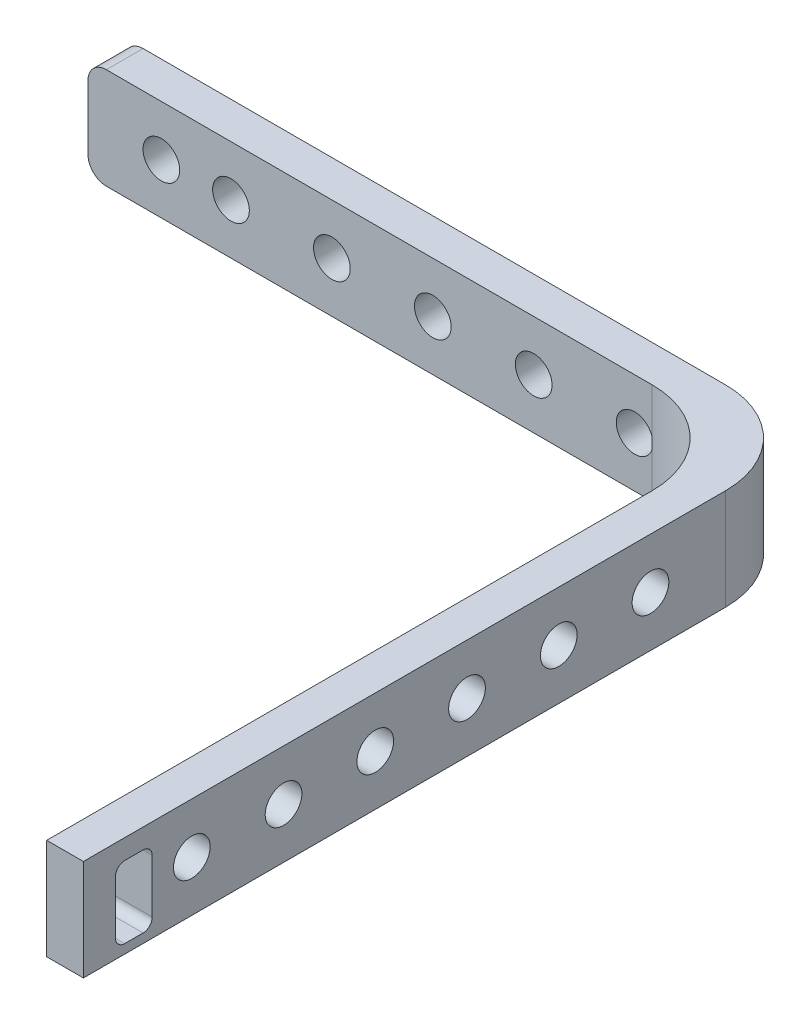
ISO-10303-21;
HEADER;
FILE_DESCRIPTION(('STEP AP214'),'2;1');
FILE_NAME('part.step','',(''),(''),'','','');
FILE_SCHEMA(('AUTOMOTIVE_DESIGN { 1 0 10303 214 1 1 1 1 }'));
ENDSEC;
DATA;
#1=APPLICATION_CONTEXT('core data for automotive mechanical design processes');
#2=APPLICATION_PROTOCOL_DEFINITION('international standard','automotive_design',2000,#1);
#3=PRODUCT_CONTEXT('',#1,'mechanical');
#4=PRODUCT('Part','Part','',(#3));
#5=PRODUCT_RELATED_PRODUCT_CATEGORY('part','',(#4));
#6=PRODUCT_DEFINITION_FORMATION('','',#4);
#7=PRODUCT_DEFINITION_CONTEXT('part definition',#1,'design');
#8=PRODUCT_DEFINITION('design','',#6,#7);
#9=PRODUCT_DEFINITION_SHAPE('','',#8);
#10=(LENGTH_UNIT() NAMED_UNIT(*) SI_UNIT(.MILLI.,.METRE.));
#11=(NAMED_UNIT(*) PLANE_ANGLE_UNIT() SI_UNIT($,.RADIAN.));
#12=(NAMED_UNIT(*) SI_UNIT($,.STERADIAN.) SOLID_ANGLE_UNIT());
#13=UNCERTAINTY_MEASURE_WITH_UNIT(LENGTH_MEASURE(1.E-05),#10,'distance_accuracy_value','');
#14=(GEOMETRIC_REPRESENTATION_CONTEXT(3) GLOBAL_UNCERTAINTY_ASSIGNED_CONTEXT((#13)) GLOBAL_UNIT_ASSIGNED_CONTEXT((#10,
#11,#12)) REPRESENTATION_CONTEXT('',''));
#15=CARTESIAN_POINT('',(0.,0.,0.));
#16=DIRECTION('',(0.,0.,1.));
#17=DIRECTION('',(1.,0.,0.));
#18=AXIS2_PLACEMENT_3D('',#15,#16,#17);
#19=CARTESIAN_POINT('',(65.5,0.,10.));
#20=DIRECTION('',(0.,1.,0.));
#21=DIRECTION('',(0.,0.,1.));
#22=AXIS2_PLACEMENT_3D('',#19,#20,#21);
#23=CYLINDRICAL_SURFACE('',#22,10.);
#24=DIRECTION('',(0.,-1.,0.));
#25=VECTOR('',#24,1.);
#26=CARTESIAN_POINT('',(65.5,0.,0.));
#27=LINE('',#26,#25);
#28=CARTESIAN_POINT('',(65.5,11.,0.));
#29=VERTEX_POINT('',#28);
#30=CARTESIAN_POINT('',(65.5,0.,0.));
#31=VERTEX_POINT('',#30);
#32=EDGE_CURVE('E459',#29,#31,#27,.T.);
#33=ORIENTED_EDGE('',*,*,#32,.F.);
#34=CARTESIAN_POINT('',(65.5,11.,10.));
#35=DIRECTION('',(0.,-1.,0.));
#36=DIRECTION('',(0.,0.,-1.));
#37=AXIS2_PLACEMENT_3D('',#34,#35,#36);
#38=CIRCLE('',#37,10.);
#39=CARTESIAN_POINT('',(75.5,11.,10.));
#40=VERTEX_POINT('',#39);
#41=EDGE_CURVE('E472',#40,#29,#38,.F.);
#42=ORIENTED_EDGE('',*,*,#41,.F.);
#43=DIRECTION('',(0.,-1.,0.));
#44=VECTOR('',#43,1.);
#45=CARTESIAN_POINT('',(75.5,0.,10.));
#46=LINE('',#45,#44);
#47=CARTESIAN_POINT('',(75.5,0.,10.));
#48=VERTEX_POINT('',#47);
#49=EDGE_CURVE('E468',#48,#40,#46,.F.);
#50=ORIENTED_EDGE('',*,*,#49,.F.);
#51=CARTESIAN_POINT('',(65.5,0.,10.));
#52=DIRECTION('',(0.,1.,0.));
#53=DIRECTION('',(0.,0.,1.));
#54=AXIS2_PLACEMENT_3D('',#51,#52,#53);
#55=CIRCLE('',#54,10.);
#56=EDGE_CURVE('E475',#31,#48,#55,.F.);
#57=ORIENTED_EDGE('',*,*,#56,.F.);
#58=EDGE_LOOP('',(#33,#42,#50,#57));
#59=FACE_BOUND('',#58,.T.);
#60=ADVANCED_FACE('F38',(#59),#23,.T.);
#61=CARTESIAN_POINT('',(61.5,0.,14.));
#62=DIRECTION('',(0.,1.,0.));
#63=DIRECTION('',(0.,0.,1.));
#64=AXIS2_PLACEMENT_3D('',#61,#62,#63);
#65=CYLINDRICAL_SURFACE('',#64,10.);
#66=DIRECTION('',(0.,1.,0.));
#67=VECTOR('',#66,1.);
#68=CARTESIAN_POINT('',(61.5,0.,4.));
#69=LINE('',#68,#67);
#70=CARTESIAN_POINT('',(61.5,0.,4.));
#71=VERTEX_POINT('',#70);
#72=CARTESIAN_POINT('',(61.5,4.91112450912952,4.));
#73=VERTEX_POINT('',#72);
#74=EDGE_CURVE('E185',#71,#73,#69,.T.);
#75=ORIENTED_EDGE('',*,*,#74,.F.);
#76=CARTESIAN_POINT('',(61.5,0.,14.));
#77=DIRECTION('',(0.,1.,0.));
#78=DIRECTION('',(0.,0.,1.));
#79=AXIS2_PLACEMENT_3D('',#76,#77,#78);
#80=CIRCLE('',#79,10.);
#81=CARTESIAN_POINT('',(71.5,0.,14.));
#82=VERTEX_POINT('',#81);
#83=EDGE_CURVE('E199',#71,#82,#80,.F.);
#84=ORIENTED_EDGE('',*,*,#83,.T.);
#85=DIRECTION('',(0.,1.,0.));
#86=VECTOR('',#85,1.);
#87=CARTESIAN_POINT('',(71.5,11.,14.));
#88=LINE('',#87,#86);
#89=CARTESIAN_POINT('',(71.5,11.,14.));
#90=VERTEX_POINT('',#89);
#91=EDGE_CURVE('E196',#90,#82,#88,.F.);
#92=ORIENTED_EDGE('',*,*,#91,.F.);
#93=CARTESIAN_POINT('',(61.5,11.,14.));
#94=DIRECTION('',(0.,-1.,0.));
#95=DIRECTION('',(0.,0.,-1.));
#96=AXIS2_PLACEMENT_3D('',#93,#94,#95);
#97=CIRCLE('',#96,10.);
#98=CARTESIAN_POINT('',(61.5,11.,4.));
#99=VERTEX_POINT('',#98);
#100=EDGE_CURVE('E457',#90,#99,#97,.F.);
#101=ORIENTED_EDGE('',*,*,#100,.T.);
#102=CARTESIAN_POINT('',(61.5,6.08887549086987,4.));
#103=VERTEX_POINT('',#102);
#104=EDGE_CURVE('E187',#103,#99,#69,.T.);
#105=ORIENTED_EDGE('',*,*,#104,.F.);
#106=EDGE_CURVE('E170',#73,#103,#69,.T.);
#107=ORIENTED_EDGE('',*,*,#106,.F.);
#108=EDGE_LOOP('',(#75,#84,#92,#101,#105,#107));
#109=FACE_BOUND('',#108,.T.);
#110=ADVANCED_FACE('F184',(#109),#65,.F.);
#111=CARTESIAN_POINT('',(0.,11.,4.));
#112=DIRECTION('',(1.,0.,0.));
#113=DIRECTION('',(0.,0.,-1.));
#114=AXIS2_PLACEMENT_3D('',#111,#112,#113);
#115=PLANE('',#114);
#116=DIRECTION('',(0.,-1.,0.));
#117=VECTOR('',#116,1.);
#118=CARTESIAN_POINT('',(0.,11.,0.));
#119=LINE('',#118,#117);
#120=CARTESIAN_POINT('',(0.,9.,0.));
#121=VERTEX_POINT('',#120);
#122=CARTESIAN_POINT('',(0.,2.,0.));
#123=VERTEX_POINT('',#122);
#124=EDGE_CURVE('E212',#121,#123,#119,.T.);
#125=ORIENTED_EDGE('',*,*,#124,.T.);
#126=DIRECTION('',(0.,0.,-1.));
#127=VECTOR('',#126,1.);
#128=CARTESIAN_POINT('',(0.,2.,4.));
#129=LINE('',#128,#127);
#130=CARTESIAN_POINT('',(0.,2.,4.));
#131=VERTEX_POINT('',#130);
#132=EDGE_CURVE('E492',#123,#131,#129,.F.);
#133=ORIENTED_EDGE('',*,*,#132,.T.);
#134=DIRECTION('',(0.,-1.,0.));
#135=VECTOR('',#134,1.);
#136=CARTESIAN_POINT('',(0.,11.,4.));
#137=LINE('',#136,#135);
#138=CARTESIAN_POINT('',(0.,9.,4.));
#139=VERTEX_POINT('',#138);
#140=EDGE_CURVE('E208',#139,#131,#137,.T.);
#141=ORIENTED_EDGE('',*,*,#140,.F.);
#142=DIRECTION('',(0.,0.,-1.));
#143=VECTOR('',#142,1.);
#144=CARTESIAN_POINT('',(0.,9.,4.));
#145=LINE('',#144,#143);
#146=EDGE_CURVE('E488',#139,#121,#145,.T.);
#147=ORIENTED_EDGE('',*,*,#146,.T.);
#148=EDGE_LOOP('',(#125,#133,#141,#147));
#149=FACE_BOUND('',#148,.T.);
#150=ADVANCED_FACE('F508',(#149),#115,.F.);
#151=CARTESIAN_POINT('',(0.,0.,4.));
#152=DIRECTION('',(0.,1.,0.));
#153=DIRECTION('',(0.,0.,1.));
#154=AXIS2_PLACEMENT_3D('',#151,#152,#153);
#155=PLANE('',#154);
#156=DIRECTION('',(1.,0.,0.));
#157=VECTOR('',#156,1.);
#158=CARTESIAN_POINT('',(0.,0.,4.));
#159=LINE('',#158,#157);
#160=CARTESIAN_POINT('',(2.,0.,4.));
#161=VERTEX_POINT('',#160);
#162=EDGE_CURVE('E193',#161,#71,#159,.T.);
#163=ORIENTED_EDGE('',*,*,#162,.F.);
#164=DIRECTION('',(0.,0.,-1.));
#165=VECTOR('',#164,1.);
#166=CARTESIAN_POINT('',(2.,0.,4.));
#167=LINE('',#166,#165);
#168=CARTESIAN_POINT('',(2.,0.,0.));
#169=VERTEX_POINT('',#168);
#170=EDGE_CURVE('E478',#161,#169,#167,.T.);
#171=ORIENTED_EDGE('',*,*,#170,.T.);
#172=DIRECTION('',(1.,0.,0.));
#173=VECTOR('',#172,1.);
#174=CARTESIAN_POINT('',(0.,0.,0.));
#175=LINE('',#174,#173);
#176=EDGE_CURVE('E216',#169,#31,#175,.T.);
#177=ORIENTED_EDGE('',*,*,#176,.T.);
#178=ORIENTED_EDGE('',*,*,#56,.T.);
#179=DIRECTION('',(0.,0.,-1.));
#180=VECTOR('',#179,1.);
#181=CARTESIAN_POINT('',(75.5,0.,0.));
#182=LINE('',#181,#180);
#183=CARTESIAN_POINT('',(75.5,0.,80.));
#184=VERTEX_POINT('',#183);
#185=EDGE_CURVE('E231',#184,#48,#182,.T.);
#186=ORIENTED_EDGE('',*,*,#185,.F.);
#187=DIRECTION('',(1.,0.,0.));
#188=VECTOR('',#187,1.);
#189=CARTESIAN_POINT('',(71.5,0.,80.));
#190=LINE('',#189,#188);
#191=CARTESIAN_POINT('',(71.5,0.,80.));
#192=VERTEX_POINT('',#191);
#193=EDGE_CURVE('E250',#192,#184,#190,.T.);
#194=ORIENTED_EDGE('',*,*,#193,.F.);
#195=DIRECTION('',(0.,0.,-1.));
#196=VECTOR('',#195,1.);
#197=CARTESIAN_POINT('',(71.5,0.,80.));
#198=LINE('',#197,#196);
#199=EDGE_CURVE('E246',#192,#82,#198,.T.);
#200=ORIENTED_EDGE('',*,*,#199,.T.);
#201=ORIENTED_EDGE('',*,*,#83,.F.);
#202=EDGE_LOOP('',(#163,#171,#177,#178,#186,#194,#200,#201));
#203=FACE_BOUND('',#202,.T.);
#204=ADVANCED_FACE('F501',(#203),#155,.F.);
#205=CARTESIAN_POINT('',(71.5,11.,4.));
#206=DIRECTION('',(0.,-1.,0.));
#207=DIRECTION('',(0.,0.,-1.));
#208=AXIS2_PLACEMENT_3D('',#205,#206,#207);
#209=PLANE('',#208);
#210=DIRECTION('',(-1.,0.,0.));
#211=VECTOR('',#210,1.);
#212=CARTESIAN_POINT('',(71.5,11.,0.));
#213=LINE('',#212,#211);
#214=CARTESIAN_POINT('',(2.,11.,0.));
#215=VERTEX_POINT('',#214);
#216=EDGE_CURVE('E219',#29,#215,#213,.T.);
#217=ORIENTED_EDGE('',*,*,#216,.T.);
#218=DIRECTION('',(0.,0.,-1.));
#219=VECTOR('',#218,1.);
#220=CARTESIAN_POINT('',(2.,11.,4.));
#221=LINE('',#220,#219);
#222=CARTESIAN_POINT('',(2.,11.,4.));
#223=VERTEX_POINT('',#222);
#224=EDGE_CURVE('E11',#215,#223,#221,.F.);
#225=ORIENTED_EDGE('',*,*,#224,.T.);
#226=DIRECTION('',(-1.,0.,0.));
#227=VECTOR('',#226,1.);
#228=CARTESIAN_POINT('',(71.5,11.,4.));
#229=LINE('',#228,#227);
#230=EDGE_CURVE('E203',#99,#223,#229,.T.);
#231=ORIENTED_EDGE('',*,*,#230,.F.);
#232=ORIENTED_EDGE('',*,*,#100,.F.);
#233=DIRECTION('',(0.,0.,-1.));
#234=VECTOR('',#233,1.);
#235=CARTESIAN_POINT('',(71.5,11.,80.));
#236=LINE('',#235,#234);
#237=CARTESIAN_POINT('',(71.5,11.,80.));
#238=VERTEX_POINT('',#237);
#239=EDGE_CURVE('E239',#238,#90,#236,.T.);
#240=ORIENTED_EDGE('',*,*,#239,.F.);
#241=DIRECTION('',(-1.,0.,0.));
#242=VECTOR('',#241,1.);
#243=CARTESIAN_POINT('',(75.5,11.,80.));
#244=LINE('',#243,#242);
#245=CARTESIAN_POINT('',(75.5,11.,80.));
#246=VERTEX_POINT('',#245);
#247=EDGE_CURVE('E257',#246,#238,#244,.T.);
#248=ORIENTED_EDGE('',*,*,#247,.F.);
#249=DIRECTION('',(0.,0.,-1.));
#250=VECTOR('',#249,1.);
#251=CARTESIAN_POINT('',(75.5,11.,0.));
#252=LINE('',#251,#250);
#253=EDGE_CURVE('E235',#246,#40,#252,.T.);
#254=ORIENTED_EDGE('',*,*,#253,.T.);
#255=ORIENTED_EDGE('',*,*,#41,.T.);
#256=EDGE_LOOP('',(#217,#225,#231,#232,#240,#248,#254,#255));
#257=FACE_BOUND('',#256,.T.);
#258=ADVANCED_FACE('F456',(#257),#209,.F.);
#259=CARTESIAN_POINT('',(0.,0.,4.));
#260=DIRECTION('',(0.,0.,1.));
#261=DIRECTION('',(1.,0.,0.));
#262=AXIS2_PLACEMENT_3D('',#259,#260,#261);
#263=PLANE('',#262);
#264=CARTESIAN_POINT('',(15.5886586761511,5.5,4.));
#265=DIRECTION('',(0.,0.,1.));
#266=DIRECTION('',(1.,0.,0.));
#267=AXIS2_PLACEMENT_3D('',#264,#265,#266);
#268=CIRCLE('',#267,2.);
#269=CARTESIAN_POINT('',(17.5886586761511,5.5,4.));
#270=VERTEX_POINT('',#269);
#271=EDGE_CURVE('E325',#270,#270,#268,.F.);
#272=ORIENTED_EDGE('',*,*,#271,.T.);
#273=EDGE_LOOP('',(#272));
#274=FACE_BOUND('',#273,.T.);
#275=CARTESIAN_POINT('',(26.5886586761511,5.49999999999992,4.));
#276=DIRECTION('',(0.,0.,1.));
#277=DIRECTION('',(1.,0.,0.));
#278=AXIS2_PLACEMENT_3D('',#275,#276,#277);
#279=CIRCLE('',#278,2.);
#280=CARTESIAN_POINT('',(28.5886586761511,5.49999999999992,4.));
#281=VERTEX_POINT('',#280);
#282=EDGE_CURVE('E366',#281,#281,#279,.F.);
#283=ORIENTED_EDGE('',*,*,#282,.T.);
#284=EDGE_LOOP('',(#283));
#285=FACE_BOUND('',#284,.T.);
#286=CARTESIAN_POINT('',(37.5886586761511,5.49999999999985,4.));
#287=DIRECTION('',(0.,0.,1.));
#288=DIRECTION('',(1.,0.,0.));
#289=AXIS2_PLACEMENT_3D('',#286,#287,#288);
#290=CIRCLE('',#289,2.);
#291=CARTESIAN_POINT('',(39.5886586761511,5.49999999999985,4.));
#292=VERTEX_POINT('',#291);
#293=EDGE_CURVE('E358',#292,#292,#290,.F.);
#294=ORIENTED_EDGE('',*,*,#293,.T.);
#295=EDGE_LOOP('',(#294));
#296=FACE_BOUND('',#295,.T.);
#297=CARTESIAN_POINT('',(48.5886586761511,5.49999999999977,4.));
#298=DIRECTION('',(0.,0.,1.));
#299=DIRECTION('',(1.,0.,0.));
#300=AXIS2_PLACEMENT_3D('',#297,#298,#299);
#301=CIRCLE('',#300,2.);
#302=CARTESIAN_POINT('',(50.5886586761511,5.49999999999977,4.));
#303=VERTEX_POINT('',#302);
#304=EDGE_CURVE('E350',#303,#303,#301,.F.);
#305=ORIENTED_EDGE('',*,*,#304,.T.);
#306=EDGE_LOOP('',(#305));
#307=FACE_BOUND('',#306,.T.);
#308=CARTESIAN_POINT('',(59.5886586761511,5.49999999999969,4.));
#309=DIRECTION('',(0.,0.,1.));
#310=DIRECTION('',(1.,0.,0.));
#311=AXIS2_PLACEMENT_3D('',#308,#309,#310);
#312=CIRCLE('',#311,2.);
#313=EDGE_CURVE('E173',#73,#103,#312,.F.);
#314=ORIENTED_EDGE('',*,*,#313,.T.);
#315=ORIENTED_EDGE('',*,*,#104,.T.);
#316=ORIENTED_EDGE('',*,*,#230,.T.);
#317=CARTESIAN_POINT('',(2.,9.,4.));
#318=DIRECTION('',(0.,0.,1.));
#319=DIRECTION('',(1.,0.,0.));
#320=AXIS2_PLACEMENT_3D('',#317,#318,#319);
#321=CIRCLE('',#320,2.);
#322=EDGE_CURVE('E495',#223,#139,#321,.T.);
#323=ORIENTED_EDGE('',*,*,#322,.T.);
#324=ORIENTED_EDGE('',*,*,#140,.T.);
#325=CARTESIAN_POINT('',(2.,2.,4.));
#326=DIRECTION('',(0.,0.,1.));
#327=DIRECTION('',(1.,0.,0.));
#328=AXIS2_PLACEMENT_3D('',#325,#326,#327);
#329=CIRCLE('',#328,2.);
#330=EDGE_CURVE('E47',#131,#161,#329,.T.);
#331=ORIENTED_EDGE('',*,*,#330,.T.);
#332=ORIENTED_EDGE('',*,*,#162,.T.);
#333=ORIENTED_EDGE('',*,*,#74,.T.);
#334=EDGE_LOOP('',(#314,#315,#316,#323,#324,#331,#332,#333));
#335=FACE_BOUND('',#334,.T.);
#336=CARTESIAN_POINT('',(8.,5.5,4.));
#337=DIRECTION('',(0.,0.,1.));
#338=DIRECTION('',(1.,0.,0.));
#339=AXIS2_PLACEMENT_3D('',#336,#337,#338);
#340=CIRCLE('',#339,2.);
#341=CARTESIAN_POINT('',(10.,5.5,4.));
#342=VERTEX_POINT('',#341);
#343=EDGE_CURVE('E227',#342,#342,#340,.T.);
#344=ORIENTED_EDGE('',*,*,#343,.F.);
#345=EDGE_LOOP('',(#344));
#346=FACE_BOUND('',#345,.T.);
#347=ADVANCED_FACE('F190',(#274,#285,#296,#307,#335,#346),#263,.T.);
#348=CARTESIAN_POINT('',(0.,0.,0.));
#349=DIRECTION('',(0.,0.,1.));
#350=DIRECTION('',(1.,0.,0.));
#351=AXIS2_PLACEMENT_3D('',#348,#349,#350);
#352=PLANE('',#351);
#353=CARTESIAN_POINT('',(15.5886586761511,5.5,0.));
#354=DIRECTION('',(0.,0.,-1.));
#355=DIRECTION('',(-1.,0.,0.));
#356=AXIS2_PLACEMENT_3D('',#353,#354,#355);
#357=CIRCLE('',#356,2.);
#358=CARTESIAN_POINT('',(13.5886586761511,5.5,0.));
#359=VERTEX_POINT('',#358);
#360=EDGE_CURVE('E370',#359,#359,#357,.T.);
#361=ORIENTED_EDGE('',*,*,#360,.F.);
#362=EDGE_LOOP('',(#361));
#363=FACE_BOUND('',#362,.T.);
#364=CARTESIAN_POINT('',(26.5886586761511,5.49999999999992,0.));
#365=DIRECTION('',(0.,0.,-1.));
#366=DIRECTION('',(-1.,0.,0.));
#367=AXIS2_PLACEMENT_3D('',#364,#365,#366);
#368=CIRCLE('',#367,2.);
#369=CARTESIAN_POINT('',(24.5886586761511,5.49999999999992,0.));
#370=VERTEX_POINT('',#369);
#371=EDGE_CURVE('E362',#370,#370,#368,.T.);
#372=ORIENTED_EDGE('',*,*,#371,.F.);
#373=EDGE_LOOP('',(#372));
#374=FACE_BOUND('',#373,.T.);
#375=CARTESIAN_POINT('',(37.5886586761511,5.49999999999985,0.));
#376=DIRECTION('',(0.,0.,-1.));
#377=DIRECTION('',(-1.,0.,0.));
#378=AXIS2_PLACEMENT_3D('',#375,#376,#377);
#379=CIRCLE('',#378,2.);
#380=CARTESIAN_POINT('',(35.5886586761511,5.49999999999985,0.));
#381=VERTEX_POINT('',#380);
#382=EDGE_CURVE('E354',#381,#381,#379,.T.);
#383=ORIENTED_EDGE('',*,*,#382,.F.);
#384=EDGE_LOOP('',(#383));
#385=FACE_BOUND('',#384,.T.);
#386=CARTESIAN_POINT('',(48.5886586761511,5.49999999999977,0.));
#387=DIRECTION('',(0.,0.,-1.));
#388=DIRECTION('',(-1.,0.,0.));
#389=AXIS2_PLACEMENT_3D('',#386,#387,#388);
#390=CIRCLE('',#389,2.);
#391=CARTESIAN_POINT('',(46.5886586761511,5.49999999999977,0.));
#392=VERTEX_POINT('',#391);
#393=EDGE_CURVE('E181',#392,#392,#390,.T.);
#394=ORIENTED_EDGE('',*,*,#393,.F.);
#395=EDGE_LOOP('',(#394));
#396=FACE_BOUND('',#395,.T.);
#397=CARTESIAN_POINT('',(59.5886586761511,5.49999999999969,0.));
#398=DIRECTION('',(0.,0.,-1.));
#399=DIRECTION('',(-1.,0.,0.));
#400=AXIS2_PLACEMENT_3D('',#397,#398,#399);
#401=CIRCLE('',#400,2.);
#402=CARTESIAN_POINT('',(57.5886586761511,5.49999999999969,0.));
#403=VERTEX_POINT('',#402);
#404=EDGE_CURVE('E174',#403,#403,#401,.T.);
#405=ORIENTED_EDGE('',*,*,#404,.F.);
#406=EDGE_LOOP('',(#405));
#407=FACE_BOUND('',#406,.T.);
#408=CARTESIAN_POINT('',(8.,5.5,0.));
#409=DIRECTION('',(0.,0.,1.));
#410=DIRECTION('',(1.,0.,0.));
#411=AXIS2_PLACEMENT_3D('',#408,#409,#410);
#412=CIRCLE('',#411,2.);
#413=CARTESIAN_POINT('',(10.,5.5,0.));
#414=VERTEX_POINT('',#413);
#415=EDGE_CURVE('E217',#414,#414,#412,.T.);
#416=ORIENTED_EDGE('',*,*,#415,.T.);
#417=EDGE_LOOP('',(#416));
#418=FACE_BOUND('',#417,.T.);
#419=ORIENTED_EDGE('',*,*,#176,.F.);
#420=CARTESIAN_POINT('',(2.,2.,0.));
#421=DIRECTION('',(0.,0.,1.));
#422=DIRECTION('',(1.,0.,0.));
#423=AXIS2_PLACEMENT_3D('',#420,#421,#422);
#424=CIRCLE('',#423,2.);
#425=EDGE_CURVE('E485',#169,#123,#424,.F.);
#426=ORIENTED_EDGE('',*,*,#425,.T.);
#427=ORIENTED_EDGE('',*,*,#124,.F.);
#428=CARTESIAN_POINT('',(2.,9.,0.));
#429=DIRECTION('',(0.,0.,1.));
#430=DIRECTION('',(1.,0.,0.));
#431=AXIS2_PLACEMENT_3D('',#428,#429,#430);
#432=CIRCLE('',#431,2.);
#433=EDGE_CURVE('E482',#121,#215,#432,.F.);
#434=ORIENTED_EDGE('',*,*,#433,.T.);
#435=ORIENTED_EDGE('',*,*,#216,.F.);
#436=ORIENTED_EDGE('',*,*,#32,.T.);
#437=EDGE_LOOP('',(#419,#426,#427,#434,#435,#436));
#438=FACE_BOUND('',#437,.T.);
#439=ADVANCED_FACE('F506',(#363,#374,#385,#396,#407,#418,#438),#352,.F.);
#440=CARTESIAN_POINT('',(8.,5.5,0.));
#441=DIRECTION('',(0.,0.,1.));
#442=DIRECTION('',(1.,0.,0.));
#443=AXIS2_PLACEMENT_3D('',#440,#441,#442);
#444=CYLINDRICAL_SURFACE('',#443,2.);
#445=ORIENTED_EDGE('',*,*,#415,.F.);
#446=EDGE_LOOP('',(#445));
#447=FACE_BOUND('',#446,.T.);
#448=ORIENTED_EDGE('',*,*,#343,.T.);
#449=EDGE_LOOP('',(#448));
#450=FACE_BOUND('',#449,.T.);
#451=ADVANCED_FACE('F520',(#447,#450),#444,.F.);
#452=CARTESIAN_POINT('',(75.5,0.,0.));
#453=DIRECTION('',(1.,0.,0.));
#454=DIRECTION('',(0.,0.,-1.));
#455=AXIS2_PLACEMENT_3D('',#452,#453,#454);
#456=PLANE('',#455);
#457=CARTESIAN_POINT('',(75.5,5.5,18.1819714199492));
#458=DIRECTION('',(1.,0.,0.));
#459=DIRECTION('',(0.,0.,-1.));
#460=AXIS2_PLACEMENT_3D('',#457,#458,#459);
#461=CIRCLE('',#460,2.);
#462=CARTESIAN_POINT('',(75.5,5.5,16.1819714199492));
#463=VERTEX_POINT('',#462);
#464=EDGE_CURVE('E349',#463,#463,#461,.F.);
#465=ORIENTED_EDGE('',*,*,#464,.T.);
#466=EDGE_LOOP('',(#465));
#467=FACE_BOUND('',#466,.T.);
#468=CARTESIAN_POINT('',(75.5,5.5,28.1819714199492));
#469=DIRECTION('',(1.,0.,0.));
#470=DIRECTION('',(0.,0.,-1.));
#471=AXIS2_PLACEMENT_3D('',#468,#469,#470);
#472=CIRCLE('',#471,2.);
#473=CARTESIAN_POINT('',(75.5,5.5,26.1819714199492));
#474=VERTEX_POINT('',#473);
#475=EDGE_CURVE('E413',#474,#474,#472,.F.);
#476=ORIENTED_EDGE('',*,*,#475,.T.);
#477=EDGE_LOOP('',(#476));
#478=FACE_BOUND('',#477,.T.);
#479=CARTESIAN_POINT('',(75.5,5.5,38.1819714199492));
#480=DIRECTION('',(1.,0.,0.));
#481=DIRECTION('',(0.,0.,-1.));
#482=AXIS2_PLACEMENT_3D('',#479,#480,#481);
#483=CIRCLE('',#482,2.);
#484=CARTESIAN_POINT('',(75.5,5.5,36.1819714199492));
#485=VERTEX_POINT('',#484);
#486=EDGE_CURVE('E405',#485,#485,#483,.F.);
#487=ORIENTED_EDGE('',*,*,#486,.T.);
#488=EDGE_LOOP('',(#487));
#489=FACE_BOUND('',#488,.T.);
#490=CARTESIAN_POINT('',(75.5,5.5,48.1819714199492));
#491=DIRECTION('',(1.,0.,0.));
#492=DIRECTION('',(0.,0.,-1.));
#493=AXIS2_PLACEMENT_3D('',#490,#491,#492);
#494=CIRCLE('',#493,2.);
#495=CARTESIAN_POINT('',(75.5,5.5,46.1819714199492));
#496=VERTEX_POINT('',#495);
#497=EDGE_CURVE('E397',#496,#496,#494,.F.);
#498=ORIENTED_EDGE('',*,*,#497,.T.);
#499=EDGE_LOOP('',(#498));
#500=FACE_BOUND('',#499,.T.);
#501=CARTESIAN_POINT('',(75.5,5.5,58.1819714199492));
#502=DIRECTION('',(1.,0.,0.));
#503=DIRECTION('',(0.,0.,-1.));
#504=AXIS2_PLACEMENT_3D('',#501,#502,#503);
#505=CIRCLE('',#504,2.);
#506=CARTESIAN_POINT('',(75.5,5.5,56.1819714199492));
#507=VERTEX_POINT('',#506);
#508=EDGE_CURVE('E389',#507,#507,#505,.F.);
#509=ORIENTED_EDGE('',*,*,#508,.T.);
#510=EDGE_LOOP('',(#509));
#511=FACE_BOUND('',#510,.T.);
#512=CARTESIAN_POINT('',(75.5,5.5,68.1819714199492));
#513=DIRECTION('',(1.,0.,0.));
#514=DIRECTION('',(0.,0.,-1.));
#515=AXIS2_PLACEMENT_3D('',#512,#513,#514);
#516=CIRCLE('',#515,2.00000000000001);
#517=CARTESIAN_POINT('',(75.5,5.5,66.1819714199491));
#518=VERTEX_POINT('',#517);
#519=EDGE_CURVE('E380',#518,#518,#516,.F.);
#520=ORIENTED_EDGE('',*,*,#519,.T.);
#521=EDGE_LOOP('',(#520));
#522=FACE_BOUND('',#521,.T.);
#523=CARTESIAN_POINT('',(75.5,7.83856293583279,75.5));
#524=DIRECTION('',(1.,0.,0.));
#525=DIRECTION('',(0.,0.,1.));
#526=AXIS2_PLACEMENT_3D('',#523,#524,#525);
#527=CIRCLE('',#526,1.);
#528=CARTESIAN_POINT('',(75.5,8.83856293583279,75.5));
#529=VERTEX_POINT('',#528);
#530=CARTESIAN_POINT('',(75.5,7.83856293583278,76.5));
#531=VERTEX_POINT('',#530);
#532=EDGE_CURVE('E322',#529,#531,#527,.T.);
#533=ORIENTED_EDGE('',*,*,#532,.F.);
#534=DIRECTION('',(0.,0.,1.));
#535=VECTOR('',#534,1.);
#536=CARTESIAN_POINT('',(75.5,8.83856293583279,75.5));
#537=LINE('',#536,#535);
#538=CARTESIAN_POINT('',(75.5,8.83856293583279,73.5));
#539=VERTEX_POINT('',#538);
#540=EDGE_CURVE('E273',#539,#529,#537,.T.);
#541=ORIENTED_EDGE('',*,*,#540,.F.);
#542=CARTESIAN_POINT('',(75.5,7.83856293583279,73.5));
#543=DIRECTION('',(1.,0.,0.));
#544=DIRECTION('',(0.,0.,1.));
#545=AXIS2_PLACEMENT_3D('',#542,#543,#544);
#546=CIRCLE('',#545,1.);
#547=CARTESIAN_POINT('',(75.5,7.83856293583278,72.5));
#548=VERTEX_POINT('',#547);
#549=EDGE_CURVE('E298',#548,#539,#546,.T.);
#550=ORIENTED_EDGE('',*,*,#549,.F.);
#551=DIRECTION('',(0.,1.,0.));
#552=VECTOR('',#551,1.);
#553=CARTESIAN_POINT('',(75.5,2.00000000000001,72.5));
#554=LINE('',#553,#552);
#555=CARTESIAN_POINT('',(75.5,2.00000000000001,72.5));
#556=VERTEX_POINT('',#555);
#557=EDGE_CURVE('E302',#556,#548,#554,.T.);
#558=ORIENTED_EDGE('',*,*,#557,.F.);
#559=CARTESIAN_POINT('',(75.5,2.,73.5));
#560=DIRECTION('',(1.,0.,0.));
#561=DIRECTION('',(0.,0.,1.));
#562=AXIS2_PLACEMENT_3D('',#559,#560,#561);
#563=CIRCLE('',#562,1.);
#564=CARTESIAN_POINT('',(75.5,0.999999999999998,73.5));
#565=VERTEX_POINT('',#564);
#566=EDGE_CURVE('E306',#565,#556,#563,.T.);
#567=ORIENTED_EDGE('',*,*,#566,.F.);
#568=DIRECTION('',(0.,0.,-1.));
#569=VECTOR('',#568,1.);
#570=CARTESIAN_POINT('',(75.5,0.999999999999998,75.5));
#571=LINE('',#570,#569);
#572=CARTESIAN_POINT('',(75.5,0.999999999999998,75.5));
#573=VERTEX_POINT('',#572);
#574=EDGE_CURVE('E310',#573,#565,#571,.T.);
#575=ORIENTED_EDGE('',*,*,#574,.F.);
#576=CARTESIAN_POINT('',(75.5,2.,75.5));
#577=DIRECTION('',(1.,0.,0.));
#578=DIRECTION('',(0.,0.,-1.));
#579=AXIS2_PLACEMENT_3D('',#576,#577,#578);
#580=CIRCLE('',#579,1.);
#581=CARTESIAN_POINT('',(75.5,2.00000000000001,76.5));
#582=VERTEX_POINT('',#581);
#583=EDGE_CURVE('E314',#582,#573,#580,.T.);
#584=ORIENTED_EDGE('',*,*,#583,.F.);
#585=DIRECTION('',(0.,-1.,0.));
#586=VECTOR('',#585,1.);
#587=CARTESIAN_POINT('',(75.5,2.00000000000001,76.5));
#588=LINE('',#587,#586);
#589=EDGE_CURVE('E318',#531,#582,#588,.T.);
#590=ORIENTED_EDGE('',*,*,#589,.F.);
#591=EDGE_LOOP('',(#533,#541,#550,#558,#567,#575,#584,#590));
#592=FACE_BOUND('',#591,.T.);
#593=ORIENTED_EDGE('',*,*,#185,.T.);
#594=ORIENTED_EDGE('',*,*,#49,.T.);
#595=ORIENTED_EDGE('',*,*,#253,.F.);
#596=DIRECTION('',(0.,1.,0.));
#597=VECTOR('',#596,1.);
#598=CARTESIAN_POINT('',(75.5,0.,80.));
#599=LINE('',#598,#597);
#600=EDGE_CURVE('E260',#184,#246,#599,.T.);
#601=ORIENTED_EDGE('',*,*,#600,.F.);
#602=EDGE_LOOP('',(#593,#594,#595,#601));
#603=FACE_BOUND('',#602,.T.);
#604=ADVANCED_FACE('F435',(#467,#478,#489,#500,#511,#522,#592,#603),#456,.T.);
#605=CARTESIAN_POINT('',(71.5,11.,80.));
#606=DIRECTION('',(1.,0.,0.));
#607=DIRECTION('',(0.,0.,-1.));
#608=AXIS2_PLACEMENT_3D('',#605,#606,#607);
#609=PLANE('',#608);
#610=CARTESIAN_POINT('',(71.5,5.5,18.1819714199492));
#611=DIRECTION('',(-1.,0.,0.));
#612=DIRECTION('',(0.,0.,1.));
#613=AXIS2_PLACEMENT_3D('',#610,#611,#612);
#614=CIRCLE('',#613,2.);
#615=CARTESIAN_POINT('',(71.5,5.5,20.1819714199492));
#616=VERTEX_POINT('',#615);
#617=EDGE_CURVE('E417',#616,#616,#614,.T.);
#618=ORIENTED_EDGE('',*,*,#617,.F.);
#619=EDGE_LOOP('',(#618));
#620=FACE_BOUND('',#619,.T.);
#621=CARTESIAN_POINT('',(71.5,5.5,28.1819714199492));
#622=DIRECTION('',(-1.,0.,0.));
#623=DIRECTION('',(0.,0.,1.));
#624=AXIS2_PLACEMENT_3D('',#621,#622,#623);
#625=CIRCLE('',#624,2.);
#626=CARTESIAN_POINT('',(71.5,5.5,30.1819714199492));
#627=VERTEX_POINT('',#626);
#628=EDGE_CURVE('E409',#627,#627,#625,.T.);
#629=ORIENTED_EDGE('',*,*,#628,.F.);
#630=EDGE_LOOP('',(#629));
#631=FACE_BOUND('',#630,.T.);
#632=CARTESIAN_POINT('',(71.5,5.5,38.1819714199492));
#633=DIRECTION('',(-1.,0.,0.));
#634=DIRECTION('',(0.,0.,1.));
#635=AXIS2_PLACEMENT_3D('',#632,#633,#634);
#636=CIRCLE('',#635,2.);
#637=CARTESIAN_POINT('',(71.5,5.5,40.1819714199492));
#638=VERTEX_POINT('',#637);
#639=EDGE_CURVE('E401',#638,#638,#636,.T.);
#640=ORIENTED_EDGE('',*,*,#639,.F.);
#641=EDGE_LOOP('',(#640));
#642=FACE_BOUND('',#641,.T.);
#643=CARTESIAN_POINT('',(71.5,5.5,48.1819714199492));
#644=DIRECTION('',(-1.,0.,0.));
#645=DIRECTION('',(0.,0.,1.));
#646=AXIS2_PLACEMENT_3D('',#643,#644,#645);
#647=CIRCLE('',#646,2.);
#648=CARTESIAN_POINT('',(71.5,5.5,50.1819714199492));
#649=VERTEX_POINT('',#648);
#650=EDGE_CURVE('E393',#649,#649,#647,.T.);
#651=ORIENTED_EDGE('',*,*,#650,.F.);
#652=EDGE_LOOP('',(#651));
#653=FACE_BOUND('',#652,.T.);
#654=CARTESIAN_POINT('',(71.5,5.5,58.1819714199492));
#655=DIRECTION('',(-1.,0.,0.));
#656=DIRECTION('',(0.,0.,1.));
#657=AXIS2_PLACEMENT_3D('',#654,#655,#656);
#658=CIRCLE('',#657,2.);
#659=CARTESIAN_POINT('',(71.5,5.5,60.1819714199492));
#660=VERTEX_POINT('',#659);
#661=EDGE_CURVE('E384',#660,#660,#658,.T.);
#662=ORIENTED_EDGE('',*,*,#661,.F.);
#663=EDGE_LOOP('',(#662));
#664=FACE_BOUND('',#663,.T.);
#665=CARTESIAN_POINT('',(71.5,5.5,68.1819714199492));
#666=DIRECTION('',(-1.,0.,0.));
#667=DIRECTION('',(0.,0.,1.));
#668=AXIS2_PLACEMENT_3D('',#665,#666,#667);
#669=CIRCLE('',#668,2.00000000000001);
#670=CARTESIAN_POINT('',(71.5,5.5,70.1819714199492));
#671=VERTEX_POINT('',#670);
#672=EDGE_CURVE('E385',#671,#671,#669,.T.);
#673=ORIENTED_EDGE('',*,*,#672,.F.);
#674=EDGE_LOOP('',(#673));
#675=FACE_BOUND('',#674,.T.);
#676=DIRECTION('',(0.,0.,-1.));
#677=VECTOR('',#676,1.);
#678=CARTESIAN_POINT('',(71.5,8.83856293583279,75.5));
#679=LINE('',#678,#677);
#680=CARTESIAN_POINT('',(71.5,8.83856293583279,75.5));
#681=VERTEX_POINT('',#680);
#682=CARTESIAN_POINT('',(71.5,8.83856293583279,73.5));
#683=VERTEX_POINT('',#682);
#684=EDGE_CURVE('E328',#681,#683,#679,.T.);
#685=ORIENTED_EDGE('',*,*,#684,.F.);
#686=CARTESIAN_POINT('',(71.5,7.83856293583279,75.5));
#687=DIRECTION('',(1.,0.,0.));
#688=DIRECTION('',(0.,0.,-1.));
#689=AXIS2_PLACEMENT_3D('',#686,#687,#688);
#690=CIRCLE('',#689,1.);
#691=CARTESIAN_POINT('',(71.5,7.83856293583278,76.5));
#692=VERTEX_POINT('',#691);
#693=EDGE_CURVE('E267',#692,#681,#690,.F.);
#694=ORIENTED_EDGE('',*,*,#693,.F.);
#695=DIRECTION('',(0.,1.,0.));
#696=VECTOR('',#695,1.);
#697=CARTESIAN_POINT('',(71.5,2.00000000000001,76.5));
#698=LINE('',#697,#696);
#699=CARTESIAN_POINT('',(71.5,2.00000000000001,76.5));
#700=VERTEX_POINT('',#699);
#701=EDGE_CURVE('E264',#700,#692,#698,.T.);
#702=ORIENTED_EDGE('',*,*,#701,.F.);
#703=CARTESIAN_POINT('',(71.5,2.,75.5));
#704=DIRECTION('',(1.,0.,0.));
#705=DIRECTION('',(0.,0.,-1.));
#706=AXIS2_PLACEMENT_3D('',#703,#704,#705);
#707=CIRCLE('',#706,1.);
#708=CARTESIAN_POINT('',(71.5,0.999999999999998,75.5));
#709=VERTEX_POINT('',#708);
#710=EDGE_CURVE('E294',#709,#700,#707,.F.);
#711=ORIENTED_EDGE('',*,*,#710,.F.);
#712=DIRECTION('',(0.,0.,1.));
#713=VECTOR('',#712,1.);
#714=CARTESIAN_POINT('',(71.5,0.999999999999998,75.5));
#715=LINE('',#714,#713);
#716=CARTESIAN_POINT('',(71.5,0.999999999999998,73.5));
#717=VERTEX_POINT('',#716);
#718=EDGE_CURVE('E340',#717,#709,#715,.T.);
#719=ORIENTED_EDGE('',*,*,#718,.F.);
#720=CARTESIAN_POINT('',(71.5,2.,73.5));
#721=DIRECTION('',(1.,0.,0.));
#722=DIRECTION('',(0.,0.,-1.));
#723=AXIS2_PLACEMENT_3D('',#720,#721,#722);
#724=CIRCLE('',#723,1.);
#725=CARTESIAN_POINT('',(71.5,2.,72.5));
#726=VERTEX_POINT('',#725);
#727=EDGE_CURVE('E337',#726,#717,#724,.F.);
#728=ORIENTED_EDGE('',*,*,#727,.F.);
#729=DIRECTION('',(0.,-1.,0.));
#730=VECTOR('',#729,1.);
#731=CARTESIAN_POINT('',(71.5,2.00000000000001,72.5));
#732=LINE('',#731,#730);
#733=CARTESIAN_POINT('',(71.5,7.83856293583278,72.5));
#734=VERTEX_POINT('',#733);
#735=EDGE_CURVE('E334',#734,#726,#732,.T.);
#736=ORIENTED_EDGE('',*,*,#735,.F.);
#737=CARTESIAN_POINT('',(71.5,7.83856293583279,73.5));
#738=DIRECTION('',(1.,0.,0.));
#739=DIRECTION('',(0.,0.,-1.));
#740=AXIS2_PLACEMENT_3D('',#737,#738,#739);
#741=CIRCLE('',#740,1.);
#742=EDGE_CURVE('E331',#683,#734,#741,.F.);
#743=ORIENTED_EDGE('',*,*,#742,.F.);
#744=EDGE_LOOP('',(#685,#694,#702,#711,#719,#728,#736,#743));
#745=FACE_BOUND('',#744,.T.);
#746=ORIENTED_EDGE('',*,*,#239,.T.);
#747=ORIENTED_EDGE('',*,*,#91,.T.);
#748=ORIENTED_EDGE('',*,*,#199,.F.);
#749=DIRECTION('',(0.,-1.,0.));
#750=VECTOR('',#749,1.);
#751=CARTESIAN_POINT('',(71.5,11.,80.));
#752=LINE('',#751,#750);
#753=EDGE_CURVE('E254',#238,#192,#752,.T.);
#754=ORIENTED_EDGE('',*,*,#753,.F.);
#755=EDGE_LOOP('',(#746,#747,#748,#754));
#756=FACE_BOUND('',#755,.T.);
#757=ADVANCED_FACE('F431',(#620,#631,#642,#653,#664,#675,#745,#756),#609,.F.);
#758=CARTESIAN_POINT('',(0.,0.,80.));
#759=DIRECTION('',(0.,0.,1.));
#760=DIRECTION('',(1.,0.,0.));
#761=AXIS2_PLACEMENT_3D('',#758,#759,#760);
#762=PLANE('',#761);
#763=ORIENTED_EDGE('',*,*,#600,.T.);
#764=ORIENTED_EDGE('',*,*,#247,.T.);
#765=ORIENTED_EDGE('',*,*,#753,.T.);
#766=ORIENTED_EDGE('',*,*,#193,.T.);
#767=EDGE_LOOP('',(#763,#764,#765,#766));
#768=FACE_BOUND('',#767,.T.);
#769=ADVANCED_FACE('F434',(#768),#762,.T.);
#770=CARTESIAN_POINT('',(62.6998256324655,7.83856293583279,75.5));
#771=DIRECTION('',(1.,0.,0.));
#772=DIRECTION('',(0.,0.,-1.));
#773=AXIS2_PLACEMENT_3D('',#770,#771,#772);
#774=CYLINDRICAL_SURFACE('',#773,1.);
#775=ORIENTED_EDGE('',*,*,#693,.T.);
#776=DIRECTION('',(1.,0.,0.));
#777=VECTOR('',#776,1.);
#778=CARTESIAN_POINT('',(62.6998256324655,8.83856293583279,75.5));
#779=LINE('',#778,#777);
#780=EDGE_CURVE('E291',#681,#529,#779,.T.);
#781=ORIENTED_EDGE('',*,*,#780,.T.);
#782=ORIENTED_EDGE('',*,*,#532,.T.);
#783=DIRECTION('',(1.,0.,0.));
#784=VECTOR('',#783,1.);
#785=CARTESIAN_POINT('',(62.6998256324655,7.83856293583278,76.5));
#786=LINE('',#785,#784);
#787=EDGE_CURVE('E268',#692,#531,#786,.T.);
#788=ORIENTED_EDGE('',*,*,#787,.F.);
#789=EDGE_LOOP('',(#775,#781,#782,#788));
#790=FACE_BOUND('',#789,.T.);
#791=ADVANCED_FACE('F553',(#790),#774,.F.);
#792=CARTESIAN_POINT('',(62.6998256324655,8.83856293583279,75.5));
#793=DIRECTION('',(0.,1.,0.));
#794=DIRECTION('',(0.,0.,1.));
#795=AXIS2_PLACEMENT_3D('',#792,#793,#794);
#796=PLANE('',#795);
#797=ORIENTED_EDGE('',*,*,#684,.T.);
#798=DIRECTION('',(1.,0.,0.));
#799=VECTOR('',#798,1.);
#800=CARTESIAN_POINT('',(62.6998256324655,8.83856293583279,73.5));
#801=LINE('',#800,#799);
#802=EDGE_CURVE('E288',#683,#539,#801,.T.);
#803=ORIENTED_EDGE('',*,*,#802,.T.);
#804=ORIENTED_EDGE('',*,*,#540,.T.);
#805=ORIENTED_EDGE('',*,*,#780,.F.);
#806=EDGE_LOOP('',(#797,#803,#804,#805));
#807=FACE_BOUND('',#806,.T.);
#808=ADVANCED_FACE('F556',(#807),#796,.F.);
#809=CARTESIAN_POINT('',(62.6998256324655,7.83856293583279,73.5));
#810=DIRECTION('',(1.,0.,0.));
#811=DIRECTION('',(0.,0.,-1.));
#812=AXIS2_PLACEMENT_3D('',#809,#810,#811);
#813=CYLINDRICAL_SURFACE('',#812,1.);
#814=ORIENTED_EDGE('',*,*,#742,.T.);
#815=DIRECTION('',(1.,0.,0.));
#816=VECTOR('',#815,1.);
#817=CARTESIAN_POINT('',(62.6998256324655,7.83856293583278,72.5));
#818=LINE('',#817,#816);
#819=EDGE_CURVE('E285',#734,#548,#818,.T.);
#820=ORIENTED_EDGE('',*,*,#819,.T.);
#821=ORIENTED_EDGE('',*,*,#549,.T.);
#822=ORIENTED_EDGE('',*,*,#802,.F.);
#823=EDGE_LOOP('',(#814,#820,#821,#822));
#824=FACE_BOUND('',#823,.T.);
#825=ADVANCED_FACE('F574',(#824),#813,.F.);
#826=CARTESIAN_POINT('',(62.6998256324655,2.00000000000001,72.5));
#827=DIRECTION('',(0.,0.,-1.));
#828=DIRECTION('',(-1.,0.,0.));
#829=AXIS2_PLACEMENT_3D('',#826,#827,#828);
#830=PLANE('',#829);
#831=ORIENTED_EDGE('',*,*,#735,.T.);
#832=DIRECTION('',(1.,0.,0.));
#833=VECTOR('',#832,1.);
#834=CARTESIAN_POINT('',(62.6998256324655,2.00000000000001,72.5));
#835=LINE('',#834,#833);
#836=EDGE_CURVE('E282',#726,#556,#835,.T.);
#837=ORIENTED_EDGE('',*,*,#836,.T.);
#838=ORIENTED_EDGE('',*,*,#557,.T.);
#839=ORIENTED_EDGE('',*,*,#819,.F.);
#840=EDGE_LOOP('',(#831,#837,#838,#839));
#841=FACE_BOUND('',#840,.T.);
#842=ADVANCED_FACE('F582',(#841),#830,.F.);
#843=CARTESIAN_POINT('',(62.6998256324655,2.,73.5));
#844=DIRECTION('',(1.,0.,0.));
#845=DIRECTION('',(0.,0.,-1.));
#846=AXIS2_PLACEMENT_3D('',#843,#844,#845);
#847=CYLINDRICAL_SURFACE('',#846,1.);
#848=ORIENTED_EDGE('',*,*,#727,.T.);
#849=DIRECTION('',(1.,0.,0.));
#850=VECTOR('',#849,1.);
#851=CARTESIAN_POINT('',(62.6998256324655,0.999999999999998,73.5));
#852=LINE('',#851,#850);
#853=EDGE_CURVE('E279',#717,#565,#852,.T.);
#854=ORIENTED_EDGE('',*,*,#853,.T.);
#855=ORIENTED_EDGE('',*,*,#566,.T.);
#856=ORIENTED_EDGE('',*,*,#836,.F.);
#857=EDGE_LOOP('',(#848,#854,#855,#856));
#858=FACE_BOUND('',#857,.T.);
#859=ADVANCED_FACE('F590',(#858),#847,.F.);
#860=CARTESIAN_POINT('',(62.6998256324655,0.999999999999998,75.5));
#861=DIRECTION('',(0.,-1.,0.));
#862=DIRECTION('',(0.,0.,-1.));
#863=AXIS2_PLACEMENT_3D('',#860,#861,#862);
#864=PLANE('',#863);
#865=ORIENTED_EDGE('',*,*,#718,.T.);
#866=DIRECTION('',(1.,0.,0.));
#867=VECTOR('',#866,1.);
#868=CARTESIAN_POINT('',(62.6998256324655,0.999999999999998,75.5));
#869=LINE('',#868,#867);
#870=EDGE_CURVE('E276',#709,#573,#869,.T.);
#871=ORIENTED_EDGE('',*,*,#870,.T.);
#872=ORIENTED_EDGE('',*,*,#574,.T.);
#873=ORIENTED_EDGE('',*,*,#853,.F.);
#874=EDGE_LOOP('',(#865,#871,#872,#873));
#875=FACE_BOUND('',#874,.T.);
#876=ADVANCED_FACE('F548',(#875),#864,.F.);
#877=CARTESIAN_POINT('',(62.6998256324655,2.,75.5));
#878=DIRECTION('',(1.,0.,0.));
#879=DIRECTION('',(0.,0.,-1.));
#880=AXIS2_PLACEMENT_3D('',#877,#878,#879);
#881=CYLINDRICAL_SURFACE('',#880,1.);
#882=ORIENTED_EDGE('',*,*,#710,.T.);
#883=DIRECTION('',(1.,0.,0.));
#884=VECTOR('',#883,1.);
#885=CARTESIAN_POINT('',(62.6998256324655,2.00000000000001,76.5));
#886=LINE('',#885,#884);
#887=EDGE_CURVE('E272',#700,#582,#886,.T.);
#888=ORIENTED_EDGE('',*,*,#887,.T.);
#889=ORIENTED_EDGE('',*,*,#583,.T.);
#890=ORIENTED_EDGE('',*,*,#870,.F.);
#891=EDGE_LOOP('',(#882,#888,#889,#890));
#892=FACE_BOUND('',#891,.T.);
#893=ADVANCED_FACE('F542',(#892),#881,.F.);
#894=CARTESIAN_POINT('',(62.6998256324655,2.00000000000001,76.5));
#895=DIRECTION('',(0.,0.,1.));
#896=DIRECTION('',(1.,0.,0.));
#897=AXIS2_PLACEMENT_3D('',#894,#895,#896);
#898=PLANE('',#897);
#899=ORIENTED_EDGE('',*,*,#701,.T.);
#900=ORIENTED_EDGE('',*,*,#787,.T.);
#901=ORIENTED_EDGE('',*,*,#589,.T.);
#902=ORIENTED_EDGE('',*,*,#887,.F.);
#903=EDGE_LOOP('',(#899,#900,#901,#902));
#904=FACE_BOUND('',#903,.T.);
#905=ADVANCED_FACE('F537',(#904),#898,.F.);
#906=CARTESIAN_POINT('',(2.,2.,4.));
#907=DIRECTION('',(0.,0.,-1.));
#908=DIRECTION('',(-1.,0.,0.));
#909=AXIS2_PLACEMENT_3D('',#906,#907,#908);
#910=CYLINDRICAL_SURFACE('',#909,2.);
#911=ORIENTED_EDGE('',*,*,#330,.F.);
#912=ORIENTED_EDGE('',*,*,#132,.F.);
#913=ORIENTED_EDGE('',*,*,#425,.F.);
#914=ORIENTED_EDGE('',*,*,#170,.F.);
#915=EDGE_LOOP('',(#911,#912,#913,#914));
#916=FACE_BOUND('',#915,.T.);
#917=ADVANCED_FACE('F503',(#916),#910,.T.);
#918=CARTESIAN_POINT('',(2.,9.,4.));
#919=DIRECTION('',(0.,0.,-1.));
#920=DIRECTION('',(-1.,0.,0.));
#921=AXIS2_PLACEMENT_3D('',#918,#919,#920);
#922=CYLINDRICAL_SURFACE('',#921,2.);
#923=ORIENTED_EDGE('',*,*,#322,.F.);
#924=ORIENTED_EDGE('',*,*,#224,.F.);
#925=ORIENTED_EDGE('',*,*,#433,.F.);
#926=ORIENTED_EDGE('',*,*,#146,.F.);
#927=EDGE_LOOP('',(#923,#924,#925,#926));
#928=FACE_BOUND('',#927,.T.);
#929=ADVANCED_FACE('F40',(#928),#922,.T.);
#930=CARTESIAN_POINT('',(0.,0.,4.));
#931=DIRECTION('',(0.,0.,1.));
#932=DIRECTION('',(1.,0.,0.));
#933=AXIS2_PLACEMENT_3D('',#930,#931,#932);
#934=PLANE('',#933);
#935=EDGE_CURVE('E53',#103,#73,#312,.F.);
#936=ORIENTED_EDGE('',*,*,#935,.T.);
#937=ORIENTED_EDGE('',*,*,#106,.T.);
#938=EDGE_LOOP('',(#936,#937));
#939=FACE_BOUND('',#938,.T.);
#940=ADVANCED_FACE('F168',(#939),#934,.F.);
#941=CARTESIAN_POINT('',(59.5886586761511,5.49999999999969,9.65685424949239));
#942=DIRECTION('',(0.,0.,-1.));
#943=DIRECTION('',(-1.,0.,0.));
#944=AXIS2_PLACEMENT_3D('',#941,#942,#943);
#945=CYLINDRICAL_SURFACE('',#944,2.);
#946=ORIENTED_EDGE('',*,*,#404,.T.);
#947=EDGE_LOOP('',(#946));
#948=FACE_BOUND('',#947,.T.);
#949=ORIENTED_EDGE('',*,*,#313,.F.);
#950=ORIENTED_EDGE('',*,*,#935,.F.);
#951=EDGE_LOOP('',(#949,#950));
#952=FACE_BOUND('',#951,.T.);
#953=ADVANCED_FACE('F176',(#948,#952),#945,.F.);
#954=CARTESIAN_POINT('',(48.5886586761511,5.49999999999977,9.65685424949239));
#955=DIRECTION('',(0.,0.,-1.));
#956=DIRECTION('',(-1.,0.,0.));
#957=AXIS2_PLACEMENT_3D('',#954,#955,#956);
#958=CYLINDRICAL_SURFACE('',#957,2.);
#959=ORIENTED_EDGE('',*,*,#393,.T.);
#960=EDGE_LOOP('',(#959));
#961=FACE_BOUND('',#960,.T.);
#962=ORIENTED_EDGE('',*,*,#304,.F.);
#963=EDGE_LOOP('',(#962));
#964=FACE_BOUND('',#963,.T.);
#965=ADVANCED_FACE('F698',(#961,#964),#958,.F.);
#966=CARTESIAN_POINT('',(37.5886586761511,5.49999999999985,9.65685424949239));
#967=DIRECTION('',(0.,0.,-1.));
#968=DIRECTION('',(-1.,0.,0.));
#969=AXIS2_PLACEMENT_3D('',#966,#967,#968);
#970=CYLINDRICAL_SURFACE('',#969,2.);
#971=ORIENTED_EDGE('',*,*,#382,.T.);
#972=EDGE_LOOP('',(#971));
#973=FACE_BOUND('',#972,.T.);
#974=ORIENTED_EDGE('',*,*,#293,.F.);
#975=EDGE_LOOP('',(#974));
#976=FACE_BOUND('',#975,.T.);
#977=ADVANCED_FACE('F708',(#973,#976),#970,.F.);
#978=CARTESIAN_POINT('',(26.5886586761511,5.49999999999992,9.65685424949239));
#979=DIRECTION('',(0.,0.,-1.));
#980=DIRECTION('',(-1.,0.,0.));
#981=AXIS2_PLACEMENT_3D('',#978,#979,#980);
#982=CYLINDRICAL_SURFACE('',#981,2.);
#983=ORIENTED_EDGE('',*,*,#371,.T.);
#984=EDGE_LOOP('',(#983));
#985=FACE_BOUND('',#984,.T.);
#986=ORIENTED_EDGE('',*,*,#282,.F.);
#987=EDGE_LOOP('',(#986));
#988=FACE_BOUND('',#987,.T.);
#989=ADVANCED_FACE('F718',(#985,#988),#982,.F.);
#990=CARTESIAN_POINT('',(15.5886586761511,5.5,9.65685424949239));
#991=DIRECTION('',(0.,0.,-1.));
#992=DIRECTION('',(-1.,0.,0.));
#993=AXIS2_PLACEMENT_3D('',#990,#991,#992);
#994=CYLINDRICAL_SURFACE('',#993,2.);
#995=ORIENTED_EDGE('',*,*,#360,.T.);
#996=EDGE_LOOP('',(#995));
#997=FACE_BOUND('',#996,.T.);
#998=ORIENTED_EDGE('',*,*,#271,.F.);
#999=EDGE_LOOP('',(#998));
#1000=FACE_BOUND('',#999,.T.);
#1001=ADVANCED_FACE('F728',(#997,#1000),#994,.F.);
#1002=CARTESIAN_POINT('',(81.1568542494924,5.5,68.1819714199492));
#1003=DIRECTION('',(-1.,0.,0.));
#1004=DIRECTION('',(0.,0.,1.));
#1005=AXIS2_PLACEMENT_3D('',#1002,#1003,#1004);
#1006=CYLINDRICAL_SURFACE('',#1005,2.00000000000001);
#1007=ORIENTED_EDGE('',*,*,#672,.T.);
#1008=EDGE_LOOP('',(#1007));
#1009=FACE_BOUND('',#1008,.T.);
#1010=ORIENTED_EDGE('',*,*,#519,.F.);
#1011=EDGE_LOOP('',(#1010));
#1012=FACE_BOUND('',#1011,.T.);
#1013=ADVANCED_FACE('F737',(#1009,#1012),#1006,.F.);
#1014=CARTESIAN_POINT('',(81.1568542494924,5.5,58.1819714199492));
#1015=DIRECTION('',(-1.,0.,0.));
#1016=DIRECTION('',(0.,0.,1.));
#1017=AXIS2_PLACEMENT_3D('',#1014,#1015,#1016);
#1018=CYLINDRICAL_SURFACE('',#1017,2.);
#1019=ORIENTED_EDGE('',*,*,#661,.T.);
#1020=EDGE_LOOP('',(#1019));
#1021=FACE_BOUND('',#1020,.T.);
#1022=ORIENTED_EDGE('',*,*,#508,.F.);
#1023=EDGE_LOOP('',(#1022));
#1024=FACE_BOUND('',#1023,.T.);
#1025=ADVANCED_FACE('F755',(#1021,#1024),#1018,.F.);
#1026=CARTESIAN_POINT('',(81.1568542494924,5.5,48.1819714199492));
#1027=DIRECTION('',(-1.,0.,0.));
#1028=DIRECTION('',(0.,0.,1.));
#1029=AXIS2_PLACEMENT_3D('',#1026,#1027,#1028);
#1030=CYLINDRICAL_SURFACE('',#1029,2.);
#1031=ORIENTED_EDGE('',*,*,#650,.T.);
#1032=EDGE_LOOP('',(#1031));
#1033=FACE_BOUND('',#1032,.T.);
#1034=ORIENTED_EDGE('',*,*,#497,.F.);
#1035=EDGE_LOOP('',(#1034));
#1036=FACE_BOUND('',#1035,.T.);
#1037=ADVANCED_FACE('F765',(#1033,#1036),#1030,.F.);
#1038=CARTESIAN_POINT('',(81.1568542494924,5.5,38.1819714199492));
#1039=DIRECTION('',(-1.,0.,0.));
#1040=DIRECTION('',(0.,0.,1.));
#1041=AXIS2_PLACEMENT_3D('',#1038,#1039,#1040);
#1042=CYLINDRICAL_SURFACE('',#1041,2.);
#1043=ORIENTED_EDGE('',*,*,#639,.T.);
#1044=EDGE_LOOP('',(#1043));
#1045=FACE_BOUND('',#1044,.T.);
#1046=ORIENTED_EDGE('',*,*,#486,.F.);
#1047=EDGE_LOOP('',(#1046));
#1048=FACE_BOUND('',#1047,.T.);
#1049=ADVANCED_FACE('F775',(#1045,#1048),#1042,.F.);
#1050=CARTESIAN_POINT('',(81.1568542494924,5.5,28.1819714199492));
#1051=DIRECTION('',(-1.,0.,0.));
#1052=DIRECTION('',(0.,0.,1.));
#1053=AXIS2_PLACEMENT_3D('',#1050,#1051,#1052);
#1054=CYLINDRICAL_SURFACE('',#1053,2.);
#1055=ORIENTED_EDGE('',*,*,#628,.T.);
#1056=EDGE_LOOP('',(#1055));
#1057=FACE_BOUND('',#1056,.T.);
#1058=ORIENTED_EDGE('',*,*,#475,.F.);
#1059=EDGE_LOOP('',(#1058));
#1060=FACE_BOUND('',#1059,.T.);
#1061=ADVANCED_FACE('F785',(#1057,#1060),#1054,.F.);
#1062=CARTESIAN_POINT('',(81.1568542494924,5.5,18.1819714199492));
#1063=DIRECTION('',(-1.,0.,0.));
#1064=DIRECTION('',(0.,0.,1.));
#1065=AXIS2_PLACEMENT_3D('',#1062,#1063,#1064);
#1066=CYLINDRICAL_SURFACE('',#1065,2.);
#1067=ORIENTED_EDGE('',*,*,#617,.T.);
#1068=EDGE_LOOP('',(#1067));
#1069=FACE_BOUND('',#1068,.T.);
#1070=ORIENTED_EDGE('',*,*,#464,.F.);
#1071=EDGE_LOOP('',(#1070));
#1072=FACE_BOUND('',#1071,.T.);
#1073=ADVANCED_FACE('F428',(#1069,#1072),#1066,.F.);
#1074=CLOSED_SHELL('',(#60,#110,#150,#204,#258,#347,#439,#451,#604,#757,#769,#791,#808,#825,
#842,#859,#876,#893,#905,#917,#929,#940,#953,#965,#977,#989,#1001,#1013,#1025,#1037,#1049,#1061,#1073));
#1075=MANIFOLD_SOLID_BREP('B2',#1074);
#1076=ADVANCED_BREP_SHAPE_REPRESENTATION('',(#18,#1075),#14);
#1077=SHAPE_DEFINITION_REPRESENTATION(#9,#1076);
ENDSEC;
END-ISO-10303-21;
